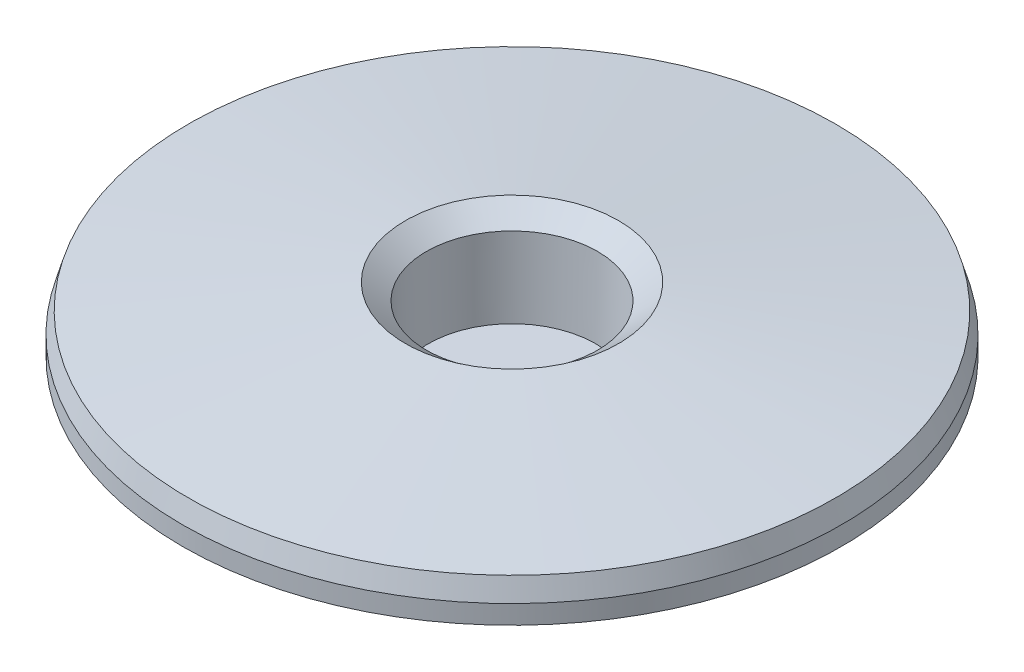
ISO-10303-21;
HEADER;
FILE_DESCRIPTION(('STEP AP214'),'2;1');
FILE_NAME('part.step','',(''),(''),'','','');
FILE_SCHEMA(('AUTOMOTIVE_DESIGN { 1 0 10303 214 1 1 1 1 }'));
ENDSEC;
DATA;
#1=APPLICATION_CONTEXT('core data for automotive mechanical design processes');
#2=APPLICATION_PROTOCOL_DEFINITION('international standard','automotive_design',2000,#1);
#3=PRODUCT_CONTEXT('',#1,'mechanical');
#4=PRODUCT('Part','Part','',(#3));
#5=PRODUCT_RELATED_PRODUCT_CATEGORY('part','',(#4));
#6=PRODUCT_DEFINITION_FORMATION('','',#4);
#7=PRODUCT_DEFINITION_CONTEXT('part definition',#1,'design');
#8=PRODUCT_DEFINITION('design','',#6,#7);
#9=PRODUCT_DEFINITION_SHAPE('','',#8);
#10=(LENGTH_UNIT() NAMED_UNIT(*) SI_UNIT(.MILLI.,.METRE.));
#11=(NAMED_UNIT(*) PLANE_ANGLE_UNIT() SI_UNIT($,.RADIAN.));
#12=(NAMED_UNIT(*) SI_UNIT($,.STERADIAN.) SOLID_ANGLE_UNIT());
#13=UNCERTAINTY_MEASURE_WITH_UNIT(LENGTH_MEASURE(1.E-05),#10,'distance_accuracy_value','');
#14=(GEOMETRIC_REPRESENTATION_CONTEXT(3) GLOBAL_UNCERTAINTY_ASSIGNED_CONTEXT((#13)) GLOBAL_UNIT_ASSIGNED_CONTEXT((#10,
#11,#12)) REPRESENTATION_CONTEXT('',''));
#15=CARTESIAN_POINT('',(0.,0.,0.));
#16=DIRECTION('',(0.,0.,1.));
#17=DIRECTION('',(1.,0.,0.));
#18=AXIS2_PLACEMENT_3D('',#15,#16,#17);
#19=CARTESIAN_POINT('',(0.,772.03935,-182.455566));
#20=DIRECTION('',(0.,1.,0.));
#21=DIRECTION('',(0.,0.,1.));
#22=AXIS2_PLACEMENT_3D('',#19,#20,#21);
#23=PLANE('',#22);
#24=CARTESIAN_POINT('',(0.,772.03935,-182.455566));
#25=DIRECTION('',(0.,-1.,0.));
#26=DIRECTION('',(0.,0.,-1.));
#27=AXIS2_PLACEMENT_3D('',#24,#25,#26);
#28=CIRCLE('',#27,28.238196);
#29=CARTESIAN_POINT('',(0.,772.03935,-210.693762));
#30=VERTEX_POINT('',#29);
#31=EDGE_CURVE('E10',#30,#30,#28,.T.);
#32=ORIENTED_EDGE('',*,*,#31,.F.);
#33=EDGE_LOOP('',(#32));
#34=FACE_BOUND('',#33,.T.);
#35=ADVANCED_FACE('F31',(#34),#23,.T.);
#36=CARTESIAN_POINT('',(0.,798.692586,-182.455566));
#37=DIRECTION('',(0.,1.,0.));
#38=DIRECTION('',(0.,0.,1.));
#39=AXIS2_PLACEMENT_3D('',#36,#37,#38);
#40=CONICAL_SURFACE('',#39,28.883102,0.0241914411396896);
#41=ORIENTED_EDGE('',*,*,#31,.T.);
#42=EDGE_LOOP('',(#41));
#43=FACE_BOUND('',#42,.T.);
#44=CARTESIAN_POINT('',(0.,798.692586,-182.455566));
#45=DIRECTION('',(0.,-1.,0.));
#46=DIRECTION('',(0.,0.,-1.));
#47=AXIS2_PLACEMENT_3D('',#44,#45,#46);
#48=CIRCLE('',#47,28.883102);
#49=CARTESIAN_POINT('',(0.,798.692586,-211.338668));
#50=VERTEX_POINT('',#49);
#51=EDGE_CURVE('E37',#50,#50,#48,.T.);
#52=ORIENTED_EDGE('',*,*,#51,.F.);
#53=EDGE_LOOP('',(#52));
#54=FACE_BOUND('',#53,.T.);
#55=ADVANCED_FACE('F79',(#43,#54),#40,.F.);
#56=CARTESIAN_POINT('',(0.,804.161206,-182.455566));
#57=DIRECTION('',(0.,1.,0.));
#58=DIRECTION('',(0.,0.,1.));
#59=AXIS2_PLACEMENT_3D('',#56,#57,#58);
#60=CONICAL_SURFACE('',#59,35.96132,0.912988409275681);
#61=ORIENTED_EDGE('',*,*,#51,.T.);
#62=EDGE_LOOP('',(#61));
#63=FACE_BOUND('',#62,.T.);
#64=CARTESIAN_POINT('',(0.,804.161206,-182.455566));
#65=DIRECTION('',(0.,-1.,0.));
#66=DIRECTION('',(0.,0.,-1.));
#67=AXIS2_PLACEMENT_3D('',#64,#65,#66);
#68=CIRCLE('',#67,35.96132);
#69=CARTESIAN_POINT('',(0.,804.161206,-218.416885999999));
#70=VERTEX_POINT('',#69);
#71=EDGE_CURVE('E41',#70,#70,#68,.T.);
#72=ORIENTED_EDGE('',*,*,#71,.F.);
#73=EDGE_LOOP('',(#72));
#74=FACE_BOUND('',#73,.T.);
#75=ADVANCED_FACE('F84',(#63,#74),#60,.F.);
#76=CARTESIAN_POINT('',(0.,795.727644,-182.455566));
#77=DIRECTION('',(0.,-1.,0.));
#78=DIRECTION('',(0.,0.,-1.));
#79=AXIS2_PLACEMENT_3D('',#76,#77,#78);
#80=CONICAL_SURFACE('',#79,109.225588,1.45618922693535);
#81=CARTESIAN_POINT('',(0.,795.727644,-182.455566));
#82=DIRECTION('',(0.,-1.,0.));
#83=DIRECTION('',(0.,0.,-1.));
#84=AXIS2_PLACEMENT_3D('',#81,#82,#83);
#85=CIRCLE('',#84,109.225588);
#86=CARTESIAN_POINT('',(0.,795.727644,-291.681153999999));
#87=VERTEX_POINT('',#86);
#88=EDGE_CURVE('E45',#87,#87,#85,.T.);
#89=CARTESIAN_POINT('',(0.,804.161206,-218.416885999999));
#90=CARTESIAN_POINT('',(0.,804.073356395833,-219.180055458333));
#91=CARTESIAN_POINT('',(0.,803.985506791667,-219.943224916666));
#92=CARTESIAN_POINT('',(0.,803.809807583333,-221.469563833333));
#93=CARTESIAN_POINT('',(0.,803.721957979167,-222.232733291666));
#94=CARTESIAN_POINT('',(0.,803.546258770833,-223.759072208333));
#95=CARTESIAN_POINT('',(0.,803.458409166667,-224.522241666666));
#96=CARTESIAN_POINT('',(0.,803.282709958333,-226.048580583333));
#97=CARTESIAN_POINT('',(0.,803.194860354167,-226.811750041666));
#98=CARTESIAN_POINT('',(0.,803.019161145833,-228.338088958333));
#99=CARTESIAN_POINT('',(0.,802.931311541667,-229.101258416666));
#100=CARTESIAN_POINT('',(0.,802.755612333333,-230.627597333333));
#101=CARTESIAN_POINT('',(0.,802.667762729167,-231.390766791666));
#102=CARTESIAN_POINT('',(0.,802.492063520833,-232.917105708333));
#103=CARTESIAN_POINT('',(0.,802.404213916667,-233.680275166666));
#104=CARTESIAN_POINT('',(0.,802.228514708333,-235.206614083333));
#105=CARTESIAN_POINT('',(0.,802.140665104167,-235.969783541666));
#106=CARTESIAN_POINT('',(0.,801.964965895833,-237.496122458333));
#107=CARTESIAN_POINT('',(0.,801.877116291667,-238.259291916666));
#108=CARTESIAN_POINT('',(0.,801.701417083333,-239.785630833333));
#109=CARTESIAN_POINT('',(0.,801.613567479167,-240.548800291666));
#110=CARTESIAN_POINT('',(0.,801.437868270833,-242.075139208333));
#111=CARTESIAN_POINT('',(0.,801.350018666667,-242.838308666666));
#112=CARTESIAN_POINT('',(0.,801.174319458333,-244.364647583333));
#113=CARTESIAN_POINT('',(0.,801.086469854167,-245.127817041666));
#114=CARTESIAN_POINT('',(0.,800.910770645833,-246.654155958333));
#115=CARTESIAN_POINT('',(0.,800.822921041667,-247.417325416666));
#116=CARTESIAN_POINT('',(0.,800.647221833333,-248.943664333333));
#117=CARTESIAN_POINT('',(0.,800.559372229167,-249.706833791666));
#118=CARTESIAN_POINT('',(0.,800.383673020833,-251.233172708333));
#119=CARTESIAN_POINT('',(0.,800.295823416667,-251.996342166666));
#120=CARTESIAN_POINT('',(0.,800.120124208333,-253.522681083333));
#121=CARTESIAN_POINT('',(0.,800.032274604167,-254.285850541666));
#122=CARTESIAN_POINT('',(0.,799.856575395833,-255.812189458333));
#123=CARTESIAN_POINT('',(0.,799.768725791667,-256.575358916666));
#124=CARTESIAN_POINT('',(0.,799.593026583333,-258.101697833333));
#125=CARTESIAN_POINT('',(0.,799.505176979167,-258.864867291666));
#126=CARTESIAN_POINT('',(0.,799.329477770833,-260.391206208333));
#127=CARTESIAN_POINT('',(0.,799.241628166667,-261.154375666666));
#128=CARTESIAN_POINT('',(0.,799.065928958333,-262.680714583333));
#129=CARTESIAN_POINT('',(0.,798.978079354167,-263.443884041666));
#130=CARTESIAN_POINT('',(0.,798.802380145833,-264.970222958333));
#131=CARTESIAN_POINT('',(0.,798.714530541667,-265.733392416666));
#132=CARTESIAN_POINT('',(0.,798.538831333333,-267.259731333333));
#133=CARTESIAN_POINT('',(0.,798.450981729167,-268.022900791666));
#134=CARTESIAN_POINT('',(0.,798.275282520833,-269.549239708333));
#135=CARTESIAN_POINT('',(0.,798.187432916667,-270.312409166666));
#136=CARTESIAN_POINT('',(0.,798.011733708333,-271.838748083333));
#137=CARTESIAN_POINT('',(0.,797.923884104167,-272.601917541666));
#138=CARTESIAN_POINT('',(0.,797.748184895833,-274.128256458333));
#139=CARTESIAN_POINT('',(0.,797.660335291667,-274.891425916666));
#140=CARTESIAN_POINT('',(0.,797.484636083333,-276.417764833333));
#141=CARTESIAN_POINT('',(0.,797.396786479167,-277.180934291666));
#142=CARTESIAN_POINT('',(0.,797.221087270833,-278.707273208333));
#143=CARTESIAN_POINT('',(0.,797.133237666667,-279.470442666666));
#144=CARTESIAN_POINT('',(0.,796.957538458333,-280.996781583333));
#145=CARTESIAN_POINT('',(0.,796.869688854167,-281.759951041666));
#146=CARTESIAN_POINT('',(0.,796.693989645833,-283.286289958333));
#147=CARTESIAN_POINT('',(0.,796.606140041667,-284.049459416666));
#148=CARTESIAN_POINT('',(0.,796.430440833333,-285.575798333333));
#149=CARTESIAN_POINT('',(0.,796.342591229167,-286.338967791666));
#150=CARTESIAN_POINT('',(0.,796.166892020833,-287.865306708333));
#151=CARTESIAN_POINT('',(0.,796.079042416667,-288.628476166666));
#152=CARTESIAN_POINT('',(0.,795.903343208333,-290.154815083333));
#153=CARTESIAN_POINT('',(0.,795.815493604167,-290.917984541666));
#154=CARTESIAN_POINT('',(0.,795.727644,-291.681153999999));
#155=B_SPLINE_CURVE_WITH_KNOTS('',3,(#89,#90,#91,#92,#93,#94,#95,#96,#97,#98,#99,#100,#101,#102,
#103,#104,#105,#106,#107,#108,#109,#110,#111,#112,#113,#114,#115,#116,#117,#118,#119,#120,#121,
#122,#123,#124,#125,#126,#127,#128,#129,#130,#131,#132,#133,#134,#135,#136,#137,#138,#139,#140,
#141,#142,#143,#144,#145,#146,#147,#148,#149,#150,#151,#152,#153,#154),.UNSPECIFIED.,.F.,.F.,(4,
2,2,2,2,2,2,2,2,2,2,2,2,2,2,2,2,2,2,2,2,2,2,2,2,2,2,2,2,2,2,2,4),(0.,2.30462720971642,
4.60925441943284,6.91388162914927,9.21850883886569,11.5231360485821,13.8277632582985,
16.132390468015,18.4370176777314,20.7416448874478,23.0462720971642,25.3508993068806,
27.6555265165971,29.9601537263135,32.2647809360299,34.5694081457464,36.8740353554628,
39.1786625651791,41.4832897748956,43.787916984612,46.0925441943284,48.3971714040448,
50.7017986137613,53.0064258234777,55.3110530331941,57.6156802429105,59.920307452627,
62.2249346623434,64.5295618720598,66.8341890817763,69.1388162914927,71.4434435012091,
73.7480707109255),.UNSPECIFIED.);
#156=EDGE_CURVE('BSEAM88',#70,#87,#155,.T.);
#157=ORIENTED_EDGE('',*,*,#71,.T.);
#158=ORIENTED_EDGE('',*,*,#88,.F.);
#159=ORIENTED_EDGE('',*,*,#156,.T.);
#160=ORIENTED_EDGE('',*,*,#156,.F.);
#161=EDGE_LOOP('',(#157,#159,#158,#160));
#162=FACE_BOUND('',#161,.T.);
#163=ADVANCED_FACE('F88',(#162),#80,.T.);
#164=CARTESIAN_POINT('',(0.,788.849578,-182.455566));
#165=DIRECTION('',(0.,-1.,0.));
#166=DIRECTION('',(0.,0.,-1.));
#167=AXIS2_PLACEMENT_3D('',#164,#165,#166);
#168=CONICAL_SURFACE('',#167,111.187992,0.277928936356792);
#169=ORIENTED_EDGE('',*,*,#88,.T.);
#170=EDGE_LOOP('',(#169));
#171=FACE_BOUND('',#170,.T.);
#172=CARTESIAN_POINT('',(0.,788.849578,-182.455566));
#173=DIRECTION('',(0.,-1.,0.));
#174=DIRECTION('',(0.,0.,-1.));
#175=AXIS2_PLACEMENT_3D('',#172,#173,#174);
#176=CIRCLE('',#175,111.187992);
#177=CARTESIAN_POINT('',(0.,788.849578,-293.643558));
#178=VERTEX_POINT('',#177);
#179=EDGE_CURVE('E50',#178,#178,#176,.T.);
#180=ORIENTED_EDGE('',*,*,#179,.F.);
#181=EDGE_LOOP('',(#180));
#182=FACE_BOUND('',#181,.T.);
#183=ADVANCED_FACE('F94',(#171,#182),#168,.T.);
#184=CARTESIAN_POINT('',(0.,765.68935,-182.455566));
#185=DIRECTION('',(0.,-1.,0.));
#186=DIRECTION('',(0.,0.,-1.));
#187=AXIS2_PLACEMENT_3D('',#184,#185,#186);
#188=CYLINDRICAL_SURFACE('',#187,111.187992);
#189=ORIENTED_EDGE('',*,*,#179,.T.);
#190=EDGE_LOOP('',(#189));
#191=FACE_BOUND('',#190,.T.);
#192=CARTESIAN_POINT('',(0.,782.499578,-182.455566));
#193=DIRECTION('',(0.,-1.,0.));
#194=DIRECTION('',(0.,0.,-1.));
#195=AXIS2_PLACEMENT_3D('',#192,#193,#194);
#196=CIRCLE('',#195,111.187992);
#197=CARTESIAN_POINT('',(0.,782.499578,-293.643557999999));
#198=VERTEX_POINT('',#197);
#199=EDGE_CURVE('E53',#198,#198,#196,.T.);
#200=ORIENTED_EDGE('',*,*,#199,.F.);
#201=EDGE_LOOP('',(#200));
#202=FACE_BOUND('',#201,.T.);
#203=ADVANCED_FACE('F75',(#191,#202),#188,.T.);
#204=CARTESIAN_POINT('',(0.,791.263340036229,-182.455566));
#205=DIRECTION('',(0.,-1.,0.));
#206=DIRECTION('',(0.,0.,-1.));
#207=AXIS2_PLACEMENT_3D('',#204,#205,#206);
#208=CONICAL_SURFACE('',#207,35.05520131079,1.45618922693535);
#209=CARTESIAN_POINT('',(0.,791.263340036229,-182.455566));
#210=DIRECTION('',(0.,-1.,0.));
#211=DIRECTION('',(0.,0.,-1.));
#212=AXIS2_PLACEMENT_3D('',#209,#210,#211);
#213=CIRCLE('',#212,35.05520131079);
#214=CARTESIAN_POINT('',(0.,791.263340036229,-217.51076731079));
#215=VERTEX_POINT('',#214);
#216=EDGE_CURVE('E56',#215,#215,#213,.T.);
#217=CARTESIAN_POINT('',(0.,782.499578,-293.643557999999));
#218=CARTESIAN_POINT('',(0.,782.590867187878,-292.850508096987));
#219=CARTESIAN_POINT('',(0.,782.682156375755,-292.057458193974));
#220=CARTESIAN_POINT('',(0.,782.86473475151,-290.471358387949));
#221=CARTESIAN_POINT('',(0.,782.956023939387,-289.678308484936));
#222=CARTESIAN_POINT('',(0.,783.138602315142,-288.092208678911));
#223=CARTESIAN_POINT('',(0.,783.229891503019,-287.299158775899));
#224=CARTESIAN_POINT('',(0.,783.412469878774,-285.713058969873));
#225=CARTESIAN_POINT('',(0.,783.503759066651,-284.920009066861));
#226=CARTESIAN_POINT('',(0.,783.686337442406,-283.333909260836));
#227=CARTESIAN_POINT('',(0.,783.777626630283,-282.540859357823));
#228=CARTESIAN_POINT('',(0.,783.960205006038,-280.954759551798));
#229=CARTESIAN_POINT('',(0.,784.051494193915,-280.161709648785));
#230=CARTESIAN_POINT('',(0.,784.23407256967,-278.57560984276));
#231=CARTESIAN_POINT('',(0.,784.325361757548,-277.782559939747));
#232=CARTESIAN_POINT('',(0.,784.507940133302,-276.196460133722));
#233=CARTESIAN_POINT('',(0.,784.59922932118,-275.40341023071));
#234=CARTESIAN_POINT('',(0.,784.781807696935,-273.817310424684));
#235=CARTESIAN_POINT('',(0.,784.873096884812,-273.024260521672));
#236=CARTESIAN_POINT('',(0.,785.055675260567,-271.438160715647));
#237=CARTESIAN_POINT('',(0.,785.146964448444,-270.645110812634));
#238=CARTESIAN_POINT('',(0.,785.329542824199,-269.059011006609));
#239=CARTESIAN_POINT('',(0.,785.420832012076,-268.265961103596));
#240=CARTESIAN_POINT('',(0.,785.603410387831,-266.679861297571));
#241=CARTESIAN_POINT('',(0.,785.694699575708,-265.886811394558));
#242=CARTESIAN_POINT('',(0.,785.877277951463,-264.300711588533));
#243=CARTESIAN_POINT('',(0.,785.968567139341,-263.507661685521));
#244=CARTESIAN_POINT('',(0.,786.151145515095,-261.921561879495));
#245=CARTESIAN_POINT('',(0.,786.242434702973,-261.128511976483));
#246=CARTESIAN_POINT('',(0.,786.425013078727,-259.542412170458));
#247=CARTESIAN_POINT('',(0.,786.516302266605,-258.749362267445));
#248=CARTESIAN_POINT('',(0.,786.69888064236,-257.16326246142));
#249=CARTESIAN_POINT('',(0.,786.790169830237,-256.370212558407));
#250=CARTESIAN_POINT('',(0.,786.972748205992,-254.784112752382));
#251=CARTESIAN_POINT('',(0.,787.064037393869,-253.991062849369));
#252=CARTESIAN_POINT('',(0.,787.246615769624,-252.404963043344));
#253=CARTESIAN_POINT('',(0.,787.337904957501,-251.611913140331));
#254=CARTESIAN_POINT('',(0.,787.520483333256,-250.025813334306));
#255=CARTESIAN_POINT('',(0.,787.611772521133,-249.232763431294));
#256=CARTESIAN_POINT('',(0.,787.794350896888,-247.646663625269));
#257=CARTESIAN_POINT('',(0.,787.885640084766,-246.853613722256));
#258=CARTESIAN_POINT('',(0.,788.06821846052,-245.267513916231));
#259=CARTESIAN_POINT('',(0.,788.159507648398,-244.474464013218));
#260=CARTESIAN_POINT('',(0.,788.342086024152,-242.888364207193));
#261=CARTESIAN_POINT('',(0.,788.43337521203,-242.09531430418));
#262=CARTESIAN_POINT('',(0.,788.615953587785,-240.509214498155));
#263=CARTESIAN_POINT('',(0.,788.707242775662,-239.716164595142));
#264=CARTESIAN_POINT('',(0.,788.889821151417,-238.130064789117));
#265=CARTESIAN_POINT('',(0.,788.981110339294,-237.337014886105));
#266=CARTESIAN_POINT('',(0.,789.163688715049,-235.750915080079));
#267=CARTESIAN_POINT('',(0.,789.254977902926,-234.957865177067));
#268=CARTESIAN_POINT('',(0.,789.437556278681,-233.371765371042));
#269=CARTESIAN_POINT('',(0.,789.528845466558,-232.578715468029));
#270=CARTESIAN_POINT('',(0.,789.711423842313,-230.992615662004));
#271=CARTESIAN_POINT('',(0.,789.802713030191,-230.199565758991));
#272=CARTESIAN_POINT('',(0.,789.985291405945,-228.613465952966));
#273=CARTESIAN_POINT('',(0.,790.076580593823,-227.820416049953));
#274=CARTESIAN_POINT('',(0.,790.259158969577,-226.234316243928));
#275=CARTESIAN_POINT('',(0.,790.350448157455,-225.441266340916));
#276=CARTESIAN_POINT('',(0.,790.53302653321,-223.85516653489));
#277=CARTESIAN_POINT('',(0.,790.624315721087,-223.062116631878));
#278=CARTESIAN_POINT('',(0.,790.806894096842,-221.476016825853));
#279=CARTESIAN_POINT('',(0.,790.898183284719,-220.68296692284));
#280=CARTESIAN_POINT('',(0.,791.080761660474,-219.096867116815));
#281=CARTESIAN_POINT('',(0.,791.172050848351,-218.303817213802));
#282=CARTESIAN_POINT('',(0.,791.263340036229,-217.51076731079));
#283=B_SPLINE_CURVE_WITH_KNOTS('',3,(#217,#218,#219,#220,#221,#222,#223,#224,#225,#226,#227,
#228,#229,#230,#231,#232,#233,#234,#235,#236,#237,#238,#239,#240,#241,#242,#243,#244,#245,#246,
#247,#248,#249,#250,#251,#252,#253,#254,#255,#256,#257,#258,#259,#260,#261,#262,#263,#264,#265,
#266,#267,#268,#269,#270,#271,#272,#273,#274,#275,#276,#277,#278,#279,#280,#281,#282),
.UNSPECIFIED.,.F.,.F.,(4,2,2,2,2,2,2,2,2,2,2,2,2,2,2,2,2,2,2,2,2,2,2,2,2,2,2,2,2,2,2,2,4),(0.,
2.39486049289399,4.78972098578798,7.18458147868196,9.579441971576,11.97430246447,
14.369162957364,16.764023450258,19.158883943152,21.553744436046,23.94860492894,26.343465421834,
28.738325914728,31.133186407622,33.528046900516,35.92290739341,38.317767886304,40.712628379198,
43.107488872092,45.502349364986,47.89720985788,50.292070350774,52.6869308436681,55.081791336562,
57.476651829456,59.87151232235,62.2663728152441,64.6612333081381,67.056093801032,
69.4509542939261,71.8458147868201,74.2406752797141,76.6355357726081),.UNSPECIFIED.);
#284=EDGE_CURVE('BSEAM67',#198,#215,#283,.T.);
#285=ORIENTED_EDGE('',*,*,#199,.T.);
#286=ORIENTED_EDGE('',*,*,#216,.F.);
#287=ORIENTED_EDGE('',*,*,#284,.T.);
#288=ORIENTED_EDGE('',*,*,#284,.F.);
#289=EDGE_LOOP('',(#285,#287,#286,#288));
#290=FACE_BOUND('',#289,.T.);
#291=ADVANCED_FACE('F67',(#290),#208,.F.);
#292=CARTESIAN_POINT('',(0.,765.68935,-182.455566));
#293=DIRECTION('',(0.,1.,0.));
#294=DIRECTION('',(0.,0.,1.));
#295=AXIS2_PLACEMENT_3D('',#292,#293,#294);
#296=CONICAL_SURFACE('',#295,34.4364089203162,0.0241914411396893);
#297=ORIENTED_EDGE('',*,*,#216,.T.);
#298=EDGE_LOOP('',(#297));
#299=FACE_BOUND('',#298,.T.);
#300=CARTESIAN_POINT('',(0.,765.68935,-182.455566));
#301=DIRECTION('',(0.,-1.,0.));
#302=DIRECTION('',(0.,0.,-1.));
#303=AXIS2_PLACEMENT_3D('',#300,#301,#302);
#304=CIRCLE('',#303,34.4364089203162);
#305=CARTESIAN_POINT('',(0.,765.68935,-216.891974920316));
#306=VERTEX_POINT('',#305);
#307=EDGE_CURVE('E59',#306,#306,#304,.T.);
#308=ORIENTED_EDGE('',*,*,#307,.F.);
#309=EDGE_LOOP('',(#308));
#310=FACE_BOUND('',#309,.T.);
#311=ADVANCED_FACE('F65',(#299,#310),#296,.T.);
#312=CARTESIAN_POINT('',(0.,765.68935,-216.891974920316));
#313=DIRECTION('',(0.,-1.,0.));
#314=DIRECTION('',(0.,0.,-1.));
#315=AXIS2_PLACEMENT_3D('',#312,#313,#314);
#316=PLANE('',#315);
#317=ORIENTED_EDGE('',*,*,#307,.T.);
#318=EDGE_LOOP('',(#317));
#319=FACE_BOUND('',#318,.T.);
#320=ADVANCED_FACE('F63',(#319),#316,.T.);
#321=CLOSED_SHELL('',(#35,#55,#75,#163,#183,#203,#291,#311,#320));
#322=MANIFOLD_SOLID_BREP('B2',#321);
#323=ADVANCED_BREP_SHAPE_REPRESENTATION('',(#18,#322),#14);
#324=SHAPE_DEFINITION_REPRESENTATION(#9,#323);
ENDSEC;
END-ISO-10303-21;
